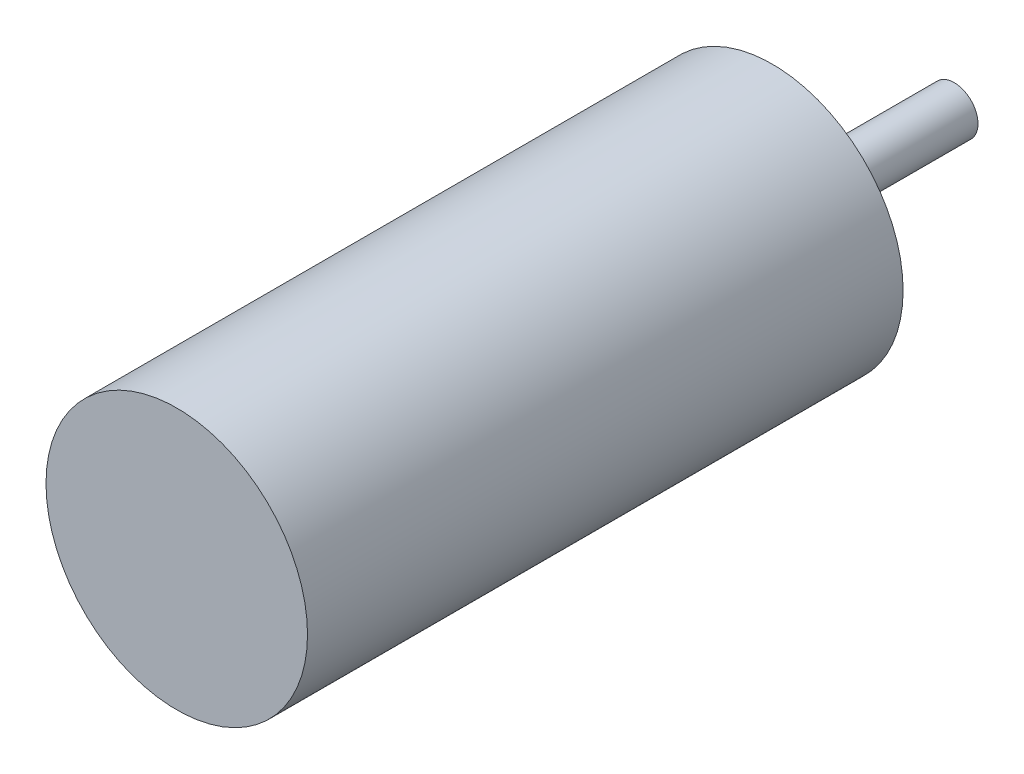
ISO-10303-21;
HEADER;
FILE_DESCRIPTION(('STEP AP214'),'2;1');
FILE_NAME('part.step','',(''),(''),'','','');
FILE_SCHEMA(('AUTOMOTIVE_DESIGN { 1 0 10303 214 1 1 1 1 }'));
ENDSEC;
DATA;
#1=APPLICATION_CONTEXT('core data for automotive mechanical design processes');
#2=APPLICATION_PROTOCOL_DEFINITION('international standard','automotive_design',2000,#1);
#3=PRODUCT_CONTEXT('',#1,'mechanical');
#4=PRODUCT('Part','Part','',(#3));
#5=PRODUCT_RELATED_PRODUCT_CATEGORY('part','',(#4));
#6=PRODUCT_DEFINITION_FORMATION('','',#4);
#7=PRODUCT_DEFINITION_CONTEXT('part definition',#1,'design');
#8=PRODUCT_DEFINITION('design','',#6,#7);
#9=PRODUCT_DEFINITION_SHAPE('','',#8);
#10=(LENGTH_UNIT() NAMED_UNIT(*) SI_UNIT(.MILLI.,.METRE.));
#11=(NAMED_UNIT(*) PLANE_ANGLE_UNIT() SI_UNIT($,.RADIAN.));
#12=(NAMED_UNIT(*) SI_UNIT($,.STERADIAN.) SOLID_ANGLE_UNIT());
#13=UNCERTAINTY_MEASURE_WITH_UNIT(LENGTH_MEASURE(1.E-05),#10,'distance_accuracy_value','');
#14=(GEOMETRIC_REPRESENTATION_CONTEXT(3) GLOBAL_UNCERTAINTY_ASSIGNED_CONTEXT((#13)) GLOBAL_UNIT_ASSIGNED_CONTEXT((#10,
#11,#12)) REPRESENTATION_CONTEXT('',''));
#15=CARTESIAN_POINT('',(0.,0.,0.));
#16=DIRECTION('',(0.,0.,1.));
#17=DIRECTION('',(1.,0.,0.));
#18=AXIS2_PLACEMENT_3D('',#15,#16,#17);
#19=CARTESIAN_POINT('',(0.,0.,50.1));
#20=DIRECTION('',(0.,0.,-1.));
#21=DIRECTION('',(-1.,0.,0.));
#22=AXIS2_PLACEMENT_3D('',#19,#20,#21);
#23=CYLINDRICAL_SURFACE('',#22,10.999999971);
#24=CARTESIAN_POINT('',(0.,0.,50.1));
#25=DIRECTION('',(0.,0.,1.));
#26=DIRECTION('',(1.,0.,0.));
#27=AXIS2_PLACEMENT_3D('',#24,#25,#26);
#28=CIRCLE('',#27,10.999999971);
#29=CARTESIAN_POINT('',(10.999999971,0.,50.1));
#30=VERTEX_POINT('',#29);
#31=EDGE_CURVE('E10',#30,#30,#28,.T.);
#32=ORIENTED_EDGE('',*,*,#31,.F.);
#33=EDGE_LOOP('',(#32));
#34=FACE_BOUND('',#33,.T.);
#35=CARTESIAN_POINT('',(0.,0.,0.));
#36=DIRECTION('',(0.,0.,1.));
#37=DIRECTION('',(1.,0.,0.));
#38=AXIS2_PLACEMENT_3D('',#35,#36,#37);
#39=CIRCLE('',#38,10.999999971);
#40=CARTESIAN_POINT('',(10.999999971,0.,0.));
#41=VERTEX_POINT('',#40);
#42=EDGE_CURVE('E40',#41,#41,#39,.T.);
#43=ORIENTED_EDGE('',*,*,#42,.T.);
#44=EDGE_LOOP('',(#43));
#45=FACE_BOUND('',#44,.T.);
#46=ADVANCED_FACE('F37',(#34,#45),#23,.T.);
#47=CARTESIAN_POINT('',(0.,0.,50.1));
#48=DIRECTION('',(0.,0.,1.));
#49=DIRECTION('',(1.,0.,0.));
#50=AXIS2_PLACEMENT_3D('',#47,#48,#49);
#51=PLANE('',#50);
#52=ORIENTED_EDGE('',*,*,#31,.T.);
#53=EDGE_LOOP('',(#52));
#54=FACE_BOUND('',#53,.T.);
#55=ADVANCED_FACE('F92',(#54),#51,.T.);
#56=CARTESIAN_POINT('',(0.,0.,0.));
#57=DIRECTION('',(0.,0.,1.));
#58=DIRECTION('',(1.,0.,0.));
#59=AXIS2_PLACEMENT_3D('',#56,#57,#58);
#60=PLANE('',#59);
#61=CARTESIAN_POINT('',(9.,0.,0.));
#62=DIRECTION('',(0.,0.,-1.));
#63=DIRECTION('',(-1.,0.,0.));
#64=AXIS2_PLACEMENT_3D('',#61,#62,#63);
#65=CIRCLE('',#64,1.1);
#66=CARTESIAN_POINT('',(7.9,0.,0.));
#67=VERTEX_POINT('',#66);
#68=EDGE_CURVE('E72',#67,#67,#65,.T.);
#69=ORIENTED_EDGE('',*,*,#68,.F.);
#70=EDGE_LOOP('',(#69));
#71=FACE_BOUND('',#70,.T.);
#72=CARTESIAN_POINT('',(0.,9.,0.));
#73=DIRECTION('',(0.,0.,-1.));
#74=DIRECTION('',(-1.,0.,0.));
#75=AXIS2_PLACEMENT_3D('',#72,#73,#74);
#76=CIRCLE('',#75,1.1);
#77=CARTESIAN_POINT('',(-1.1,9.,0.));
#78=VERTEX_POINT('',#77);
#79=EDGE_CURVE('E66',#78,#78,#76,.T.);
#80=ORIENTED_EDGE('',*,*,#79,.F.);
#81=EDGE_LOOP('',(#80));
#82=FACE_BOUND('',#81,.T.);
#83=CARTESIAN_POINT('',(-9.,0.,0.));
#84=DIRECTION('',(0.,0.,-1.));
#85=DIRECTION('',(-1.,0.,0.));
#86=AXIS2_PLACEMENT_3D('',#83,#84,#85);
#87=CIRCLE('',#86,1.1);
#88=CARTESIAN_POINT('',(-10.1,0.,0.));
#89=VERTEX_POINT('',#88);
#90=EDGE_CURVE('E60',#89,#89,#87,.T.);
#91=ORIENTED_EDGE('',*,*,#90,.F.);
#92=EDGE_LOOP('',(#91));
#93=FACE_BOUND('',#92,.T.);
#94=CARTESIAN_POINT('',(0.,-9.,0.));
#95=DIRECTION('',(0.,0.,-1.));
#96=DIRECTION('',(-1.,0.,0.));
#97=AXIS2_PLACEMENT_3D('',#94,#95,#96);
#98=CIRCLE('',#97,1.1);
#99=CARTESIAN_POINT('',(-1.1,-9.,0.));
#100=VERTEX_POINT('',#99);
#101=EDGE_CURVE('E52',#100,#100,#98,.T.);
#102=ORIENTED_EDGE('',*,*,#101,.F.);
#103=EDGE_LOOP('',(#102));
#104=FACE_BOUND('',#103,.T.);
#105=CARTESIAN_POINT('',(0.,0.,0.));
#106=DIRECTION('',(0.,0.,1.));
#107=DIRECTION('',(1.,0.,0.));
#108=AXIS2_PLACEMENT_3D('',#105,#106,#107);
#109=CIRCLE('',#108,2.);
#110=CARTESIAN_POINT('',(2.,0.,0.));
#111=VERTEX_POINT('',#110);
#112=EDGE_CURVE('E49',#111,#111,#109,.T.);
#113=ORIENTED_EDGE('',*,*,#112,.T.);
#114=EDGE_LOOP('',(#113));
#115=FACE_BOUND('',#114,.T.);
#116=ORIENTED_EDGE('',*,*,#42,.F.);
#117=EDGE_LOOP('',(#116));
#118=FACE_BOUND('',#117,.T.);
#119=ADVANCED_FACE('F88',(#71,#82,#93,#104,#115,#118),#60,.F.);
#120=CARTESIAN_POINT('',(0.,0.,-15.3));
#121=DIRECTION('',(0.,0.,1.));
#122=DIRECTION('',(1.,0.,0.));
#123=AXIS2_PLACEMENT_3D('',#120,#121,#122);
#124=CYLINDRICAL_SURFACE('',#123,2.);
#125=CARTESIAN_POINT('',(0.,0.,-15.3));
#126=DIRECTION('',(0.,0.,1.));
#127=DIRECTION('',(1.,0.,0.));
#128=AXIS2_PLACEMENT_3D('',#125,#126,#127);
#129=CIRCLE('',#128,2.);
#130=CARTESIAN_POINT('',(2.,0.,-15.3));
#131=VERTEX_POINT('',#130);
#132=EDGE_CURVE('E47',#131,#131,#129,.T.);
#133=ORIENTED_EDGE('',*,*,#132,.T.);
#134=EDGE_LOOP('',(#133));
#135=FACE_BOUND('',#134,.T.);
#136=ORIENTED_EDGE('',*,*,#112,.F.);
#137=EDGE_LOOP('',(#136));
#138=FACE_BOUND('',#137,.T.);
#139=ADVANCED_FACE('F91',(#135,#138),#124,.T.);
#140=CARTESIAN_POINT('',(0.,0.,-15.3));
#141=DIRECTION('',(0.,0.,1.));
#142=DIRECTION('',(1.,0.,0.));
#143=AXIS2_PLACEMENT_3D('',#140,#141,#142);
#144=PLANE('',#143);
#145=ORIENTED_EDGE('',*,*,#132,.F.);
#146=EDGE_LOOP('',(#145));
#147=FACE_BOUND('',#146,.T.);
#148=ADVANCED_FACE('F114',(#147),#144,.F.);
#149=CARTESIAN_POINT('',(0.,-9.,0.));
#150=DIRECTION('',(0.,0.,-1.));
#151=DIRECTION('',(-1.,0.,0.));
#152=AXIS2_PLACEMENT_3D('',#149,#150,#151);
#153=CYLINDRICAL_SURFACE('',#152,1.1);
#154=CARTESIAN_POINT('',(0.,-9.,2.));
#155=DIRECTION('',(0.,0.,-1.));
#156=DIRECTION('',(-1.,0.,0.));
#157=AXIS2_PLACEMENT_3D('',#154,#155,#156);
#158=CIRCLE('',#157,1.1);
#159=CARTESIAN_POINT('',(-1.1,-9.,2.));
#160=VERTEX_POINT('',#159);
#161=EDGE_CURVE('E57',#160,#160,#158,.T.);
#162=ORIENTED_EDGE('',*,*,#161,.F.);
#163=EDGE_LOOP('',(#162));
#164=FACE_BOUND('',#163,.T.);
#165=ORIENTED_EDGE('',*,*,#101,.T.);
#166=EDGE_LOOP('',(#165));
#167=FACE_BOUND('',#166,.T.);
#168=ADVANCED_FACE('F118',(#164,#167),#153,.F.);
#169=CARTESIAN_POINT('',(1.1,-9.,2.));
#170=DIRECTION('',(0.,0.,1.));
#171=DIRECTION('',(1.,0.,0.));
#172=AXIS2_PLACEMENT_3D('',#169,#170,#171);
#173=PLANE('',#172);
#174=ORIENTED_EDGE('',*,*,#161,.T.);
#175=EDGE_LOOP('',(#174));
#176=FACE_BOUND('',#175,.T.);
#177=ADVANCED_FACE('F122',(#176),#173,.F.);
#178=CARTESIAN_POINT('',(-9.,0.,0.));
#179=DIRECTION('',(0.,0.,-1.));
#180=DIRECTION('',(-1.,0.,0.));
#181=AXIS2_PLACEMENT_3D('',#178,#179,#180);
#182=CYLINDRICAL_SURFACE('',#181,1.1);
#183=CARTESIAN_POINT('',(-9.,0.,2.));
#184=DIRECTION('',(0.,0.,-1.));
#185=DIRECTION('',(-1.,0.,0.));
#186=AXIS2_PLACEMENT_3D('',#183,#184,#185);
#187=CIRCLE('',#186,1.1);
#188=CARTESIAN_POINT('',(-10.1,0.,2.));
#189=VERTEX_POINT('',#188);
#190=EDGE_CURVE('E63',#189,#189,#187,.T.);
#191=ORIENTED_EDGE('',*,*,#190,.F.);
#192=EDGE_LOOP('',(#191));
#193=FACE_BOUND('',#192,.T.);
#194=ORIENTED_EDGE('',*,*,#90,.T.);
#195=EDGE_LOOP('',(#194));
#196=FACE_BOUND('',#195,.T.);
#197=ADVANCED_FACE('F126',(#193,#196),#182,.F.);
#198=CARTESIAN_POINT('',(-7.9,0.,2.));
#199=DIRECTION('',(0.,0.,1.));
#200=DIRECTION('',(1.,0.,0.));
#201=AXIS2_PLACEMENT_3D('',#198,#199,#200);
#202=PLANE('',#201);
#203=ORIENTED_EDGE('',*,*,#190,.T.);
#204=EDGE_LOOP('',(#203));
#205=FACE_BOUND('',#204,.T.);
#206=ADVANCED_FACE('F130',(#205),#202,.F.);
#207=CARTESIAN_POINT('',(0.,9.,0.));
#208=DIRECTION('',(0.,0.,-1.));
#209=DIRECTION('',(-1.,0.,0.));
#210=AXIS2_PLACEMENT_3D('',#207,#208,#209);
#211=CYLINDRICAL_SURFACE('',#210,1.1);
#212=CARTESIAN_POINT('',(0.,9.,2.));
#213=DIRECTION('',(0.,0.,-1.));
#214=DIRECTION('',(-1.,0.,0.));
#215=AXIS2_PLACEMENT_3D('',#212,#213,#214);
#216=CIRCLE('',#215,1.1);
#217=CARTESIAN_POINT('',(-1.1,9.,2.));
#218=VERTEX_POINT('',#217);
#219=EDGE_CURVE('E69',#218,#218,#216,.T.);
#220=ORIENTED_EDGE('',*,*,#219,.F.);
#221=EDGE_LOOP('',(#220));
#222=FACE_BOUND('',#221,.T.);
#223=ORIENTED_EDGE('',*,*,#79,.T.);
#224=EDGE_LOOP('',(#223));
#225=FACE_BOUND('',#224,.T.);
#226=ADVANCED_FACE('F134',(#222,#225),#211,.F.);
#227=CARTESIAN_POINT('',(1.1,9.,2.));
#228=DIRECTION('',(0.,0.,1.));
#229=DIRECTION('',(1.,0.,0.));
#230=AXIS2_PLACEMENT_3D('',#227,#228,#229);
#231=PLANE('',#230);
#232=ORIENTED_EDGE('',*,*,#219,.T.);
#233=EDGE_LOOP('',(#232));
#234=FACE_BOUND('',#233,.T.);
#235=ADVANCED_FACE('F84',(#234),#231,.F.);
#236=CARTESIAN_POINT('',(9.,0.,0.));
#237=DIRECTION('',(0.,0.,-1.));
#238=DIRECTION('',(-1.,0.,0.));
#239=AXIS2_PLACEMENT_3D('',#236,#237,#238);
#240=CYLINDRICAL_SURFACE('',#239,1.1);
#241=CARTESIAN_POINT('',(9.,0.,2.));
#242=DIRECTION('',(0.,0.,-1.));
#243=DIRECTION('',(-1.,0.,0.));
#244=AXIS2_PLACEMENT_3D('',#241,#242,#243);
#245=CIRCLE('',#244,1.1);
#246=CARTESIAN_POINT('',(7.9,0.,2.));
#247=VERTEX_POINT('',#246);
#248=EDGE_CURVE('E75',#247,#247,#245,.T.);
#249=ORIENTED_EDGE('',*,*,#248,.F.);
#250=EDGE_LOOP('',(#249));
#251=FACE_BOUND('',#250,.T.);
#252=ORIENTED_EDGE('',*,*,#68,.T.);
#253=EDGE_LOOP('',(#252));
#254=FACE_BOUND('',#253,.T.);
#255=ADVANCED_FACE('F81',(#251,#254),#240,.F.);
#256=CARTESIAN_POINT('',(10.1,0.,2.));
#257=DIRECTION('',(0.,0.,1.));
#258=DIRECTION('',(1.,0.,0.));
#259=AXIS2_PLACEMENT_3D('',#256,#257,#258);
#260=PLANE('',#259);
#261=ORIENTED_EDGE('',*,*,#248,.T.);
#262=EDGE_LOOP('',(#261));
#263=FACE_BOUND('',#262,.T.);
#264=ADVANCED_FACE('F79',(#263),#260,.F.);
#265=CLOSED_SHELL('',(#46,#55,#119,#139,#148,#168,#177,#197,#206,#226,#235,#255,#264));
#266=MANIFOLD_SOLID_BREP('B2',#265);
#267=ADVANCED_BREP_SHAPE_REPRESENTATION('',(#18,#266),#14);
#268=SHAPE_DEFINITION_REPRESENTATION(#9,#267);
ENDSEC;
END-ISO-10303-21;
